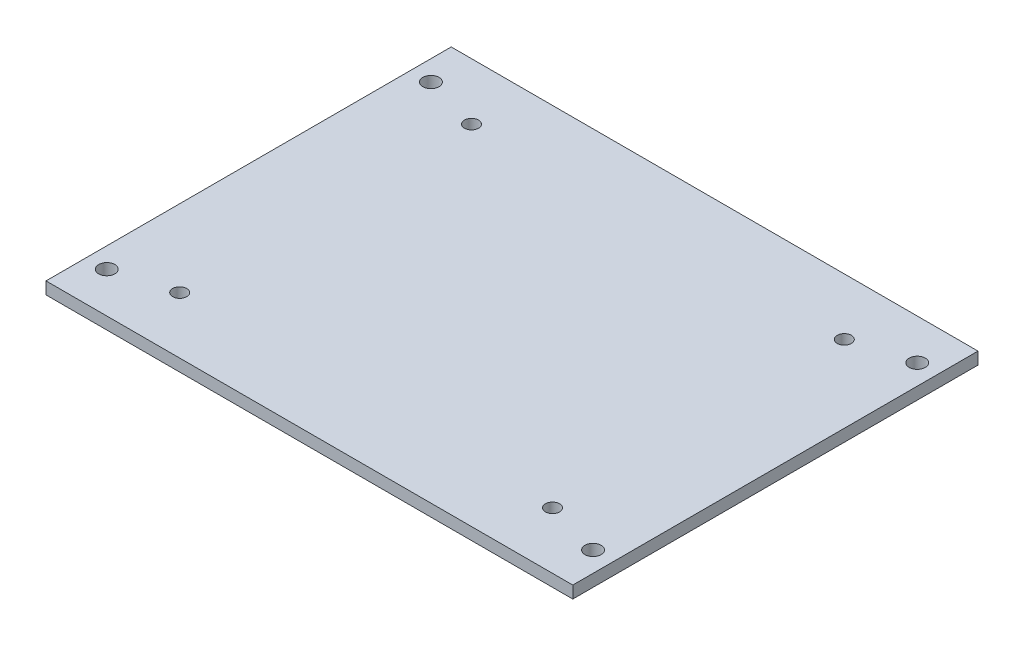
ISO-10303-21;
HEADER;
FILE_DESCRIPTION(('STEP AP214'),'2;1');
FILE_NAME('part.step','',(''),(''),'','','');
FILE_SCHEMA(('AUTOMOTIVE_DESIGN { 1 0 10303 214 1 1 1 1 }'));
ENDSEC;
DATA;
#1=APPLICATION_CONTEXT('core data for automotive mechanical design processes');
#2=APPLICATION_PROTOCOL_DEFINITION('international standard','automotive_design',2000,#1);
#3=PRODUCT_CONTEXT('',#1,'mechanical');
#4=PRODUCT('Part','Part','',(#3));
#5=PRODUCT_RELATED_PRODUCT_CATEGORY('part','',(#4));
#6=PRODUCT_DEFINITION_FORMATION('','',#4);
#7=PRODUCT_DEFINITION_CONTEXT('part definition',#1,'design');
#8=PRODUCT_DEFINITION('design','',#6,#7);
#9=PRODUCT_DEFINITION_SHAPE('','',#8);
#10=(LENGTH_UNIT() NAMED_UNIT(*) SI_UNIT(.MILLI.,.METRE.));
#11=(NAMED_UNIT(*) PLANE_ANGLE_UNIT() SI_UNIT($,.RADIAN.));
#12=(NAMED_UNIT(*) SI_UNIT($,.STERADIAN.) SOLID_ANGLE_UNIT());
#13=UNCERTAINTY_MEASURE_WITH_UNIT(LENGTH_MEASURE(1.E-05),#10,'distance_accuracy_value','');
#14=(GEOMETRIC_REPRESENTATION_CONTEXT(3) GLOBAL_UNCERTAINTY_ASSIGNED_CONTEXT((#13)) GLOBAL_UNIT_ASSIGNED_CONTEXT((#10,
#11,#12)) REPRESENTATION_CONTEXT('',''));
#15=CARTESIAN_POINT('',(0.,0.,0.));
#16=DIRECTION('',(0.,0.,1.));
#17=DIRECTION('',(1.,0.,0.));
#18=AXIS2_PLACEMENT_3D('',#15,#16,#17);
#19=CARTESIAN_POINT('',(-130.,3.,-100.));
#20=DIRECTION('',(1.,0.,0.));
#21=DIRECTION('',(0.,0.,-1.));
#22=AXIS2_PLACEMENT_3D('',#19,#20,#21);
#23=PLANE('',#22);
#24=DIRECTION('',(0.,0.,1.));
#25=VECTOR('',#24,1.);
#26=CARTESIAN_POINT('',(-130.,0.,-100.));
#27=LINE('',#26,#25);
#28=CARTESIAN_POINT('',(-130.,0.,-100.));
#29=VERTEX_POINT('',#28);
#30=CARTESIAN_POINT('',(-130.,0.,0.));
#31=VERTEX_POINT('',#30);
#32=EDGE_CURVE('E109',#29,#31,#27,.T.);
#33=ORIENTED_EDGE('',*,*,#32,.T.);
#34=DIRECTION('',(0.,-1.,0.));
#35=VECTOR('',#34,1.);
#36=CARTESIAN_POINT('',(-130.,3.,0.));
#37=LINE('',#36,#35);
#38=CARTESIAN_POINT('',(-130.,3.,0.));
#39=VERTEX_POINT('',#38);
#40=EDGE_CURVE('E11',#39,#31,#37,.T.);
#41=ORIENTED_EDGE('',*,*,#40,.F.);
#42=DIRECTION('',(0.,0.,1.));
#43=VECTOR('',#42,1.);
#44=CARTESIAN_POINT('',(-130.,3.,-100.));
#45=LINE('',#44,#43);
#46=CARTESIAN_POINT('',(-130.,3.,-100.));
#47=VERTEX_POINT('',#46);
#48=EDGE_CURVE('E92',#47,#39,#45,.T.);
#49=ORIENTED_EDGE('',*,*,#48,.F.);
#50=DIRECTION('',(0.,-1.,0.));
#51=VECTOR('',#50,1.);
#52=CARTESIAN_POINT('',(-130.,3.,-100.));
#53=LINE('',#52,#51);
#54=EDGE_CURVE('E105',#47,#29,#53,.T.);
#55=ORIENTED_EDGE('',*,*,#54,.T.);
#56=EDGE_LOOP('',(#33,#41,#49,#55));
#57=FACE_BOUND('',#56,.T.);
#58=ADVANCED_FACE('F38',(#57),#23,.F.);
#59=CARTESIAN_POINT('',(-130.,3.,0.));
#60=DIRECTION('',(0.,0.,-1.));
#61=DIRECTION('',(-1.,0.,0.));
#62=AXIS2_PLACEMENT_3D('',#59,#60,#61);
#63=PLANE('',#62);
#64=DIRECTION('',(1.,0.,0.));
#65=VECTOR('',#64,1.);
#66=CARTESIAN_POINT('',(-130.,0.,0.));
#67=LINE('',#66,#65);
#68=CARTESIAN_POINT('',(0.,0.,0.));
#69=VERTEX_POINT('',#68);
#70=EDGE_CURVE('E97',#31,#69,#67,.T.);
#71=ORIENTED_EDGE('',*,*,#70,.T.);
#72=DIRECTION('',(0.,-1.,0.));
#73=VECTOR('',#72,1.);
#74=CARTESIAN_POINT('',(0.,3.,0.));
#75=LINE('',#74,#73);
#76=CARTESIAN_POINT('',(0.,3.,0.));
#77=VERTEX_POINT('',#76);
#78=EDGE_CURVE('E48',#77,#69,#75,.T.);
#79=ORIENTED_EDGE('',*,*,#78,.F.);
#80=DIRECTION('',(1.,0.,0.));
#81=VECTOR('',#80,1.);
#82=CARTESIAN_POINT('',(-130.,3.,0.));
#83=LINE('',#82,#81);
#84=EDGE_CURVE('E87',#39,#77,#83,.T.);
#85=ORIENTED_EDGE('',*,*,#84,.F.);
#86=ORIENTED_EDGE('',*,*,#40,.T.);
#87=EDGE_LOOP('',(#71,#79,#85,#86));
#88=FACE_BOUND('',#87,.T.);
#89=ADVANCED_FACE('F96',(#88),#63,.F.);
#90=CARTESIAN_POINT('',(0.,3.,-100.));
#91=DIRECTION('',(-1.,0.,0.));
#92=DIRECTION('',(0.,0.,1.));
#93=AXIS2_PLACEMENT_3D('',#90,#91,#92);
#94=PLANE('',#93);
#95=DIRECTION('',(0.,0.,-1.));
#96=VECTOR('',#95,1.);
#97=CARTESIAN_POINT('',(0.,0.,-100.));
#98=LINE('',#97,#96);
#99=CARTESIAN_POINT('',(0.,0.,-100.));
#100=VERTEX_POINT('',#99);
#101=EDGE_CURVE('E74',#69,#100,#98,.T.);
#102=ORIENTED_EDGE('',*,*,#101,.T.);
#103=DIRECTION('',(0.,-1.,0.));
#104=VECTOR('',#103,1.);
#105=CARTESIAN_POINT('',(0.,3.,-100.));
#106=LINE('',#105,#104);
#107=CARTESIAN_POINT('',(0.,3.,-100.));
#108=VERTEX_POINT('',#107);
#109=EDGE_CURVE('E99',#108,#100,#106,.T.);
#110=ORIENTED_EDGE('',*,*,#109,.F.);
#111=DIRECTION('',(0.,0.,-1.));
#112=VECTOR('',#111,1.);
#113=CARTESIAN_POINT('',(0.,3.,-100.));
#114=LINE('',#113,#112);
#115=EDGE_CURVE('E90',#77,#108,#114,.T.);
#116=ORIENTED_EDGE('',*,*,#115,.F.);
#117=ORIENTED_EDGE('',*,*,#78,.T.);
#118=EDGE_LOOP('',(#102,#110,#116,#117));
#119=FACE_BOUND('',#118,.T.);
#120=ADVANCED_FACE('F101',(#119),#94,.F.);
#121=CARTESIAN_POINT('',(-130.,3.,-100.));
#122=DIRECTION('',(0.,0.,1.));
#123=DIRECTION('',(1.,0.,0.));
#124=AXIS2_PLACEMENT_3D('',#121,#122,#123);
#125=PLANE('',#124);
#126=DIRECTION('',(-1.,0.,0.));
#127=VECTOR('',#126,1.);
#128=CARTESIAN_POINT('',(-130.,0.,-100.));
#129=LINE('',#128,#127);
#130=EDGE_CURVE('E80',#100,#29,#129,.T.);
#131=ORIENTED_EDGE('',*,*,#130,.T.);
#132=ORIENTED_EDGE('',*,*,#54,.F.);
#133=DIRECTION('',(-1.,0.,0.));
#134=VECTOR('',#133,1.);
#135=CARTESIAN_POINT('',(-130.,3.,-100.));
#136=LINE('',#135,#134);
#137=EDGE_CURVE('E57',#108,#47,#136,.T.);
#138=ORIENTED_EDGE('',*,*,#137,.F.);
#139=ORIENTED_EDGE('',*,*,#109,.T.);
#140=EDGE_LOOP('',(#131,#132,#138,#139));
#141=FACE_BOUND('',#140,.T.);
#142=ADVANCED_FACE('F192',(#141),#125,.F.);
#143=CARTESIAN_POINT('',(0.,3.,0.));
#144=DIRECTION('',(0.,1.,0.));
#145=DIRECTION('',(0.,0.,1.));
#146=AXIS2_PLACEMENT_3D('',#143,#144,#145);
#147=PLANE('',#146);
#148=CARTESIAN_POINT('',(-5.,3.,-10.));
#149=DIRECTION('',(0.,1.,0.));
#150=DIRECTION('',(0.,0.,1.));
#151=AXIS2_PLACEMENT_3D('',#148,#149,#150);
#152=CIRCLE('',#151,2.);
#153=CARTESIAN_POINT('',(-5.,3.,-8.));
#154=VERTEX_POINT('',#153);
#155=EDGE_CURVE('E150',#154,#154,#152,.T.);
#156=ORIENTED_EDGE('',*,*,#155,.F.);
#157=EDGE_LOOP('',(#156));
#158=FACE_BOUND('',#157,.T.);
#159=CARTESIAN_POINT('',(-125.,3.,-10.));
#160=DIRECTION('',(0.,1.,0.));
#161=DIRECTION('',(0.,0.,1.));
#162=AXIS2_PLACEMENT_3D('',#159,#160,#161);
#163=CIRCLE('',#162,2.);
#164=CARTESIAN_POINT('',(-125.,3.,-8.));
#165=VERTEX_POINT('',#164);
#166=EDGE_CURVE('E137',#165,#165,#163,.T.);
#167=ORIENTED_EDGE('',*,*,#166,.F.);
#168=EDGE_LOOP('',(#167));
#169=FACE_BOUND('',#168,.T.);
#170=CARTESIAN_POINT('',(-5.,3.,-90.));
#171=DIRECTION('',(0.,1.,0.));
#172=DIRECTION('',(0.,0.,1.));
#173=AXIS2_PLACEMENT_3D('',#170,#171,#172);
#174=CIRCLE('',#173,2.);
#175=CARTESIAN_POINT('',(-5.,3.,-88.));
#176=VERTEX_POINT('',#175);
#177=EDGE_CURVE('E129',#176,#176,#174,.T.);
#178=ORIENTED_EDGE('',*,*,#177,.F.);
#179=EDGE_LOOP('',(#178));
#180=FACE_BOUND('',#179,.T.);
#181=CARTESIAN_POINT('',(-125.,3.,-90.));
#182=DIRECTION('',(0.,1.,0.));
#183=DIRECTION('',(0.,0.,1.));
#184=AXIS2_PLACEMENT_3D('',#181,#182,#183);
#185=CIRCLE('',#184,2.);
#186=CARTESIAN_POINT('',(-125.,3.,-88.));
#187=VERTEX_POINT('',#186);
#188=EDGE_CURVE('E136',#187,#187,#185,.T.);
#189=ORIENTED_EDGE('',*,*,#188,.F.);
#190=EDGE_LOOP('',(#189));
#191=FACE_BOUND('',#190,.T.);
#192=CARTESIAN_POINT('',(-111.,3.,-14.));
#193=DIRECTION('',(0.,1.,0.));
#194=DIRECTION('',(0.,0.,1.));
#195=AXIS2_PLACEMENT_3D('',#192,#193,#194);
#196=CIRCLE('',#195,1.75);
#197=CARTESIAN_POINT('',(-111.,3.,-12.25));
#198=VERTEX_POINT('',#197);
#199=EDGE_CURVE('E132',#198,#198,#196,.T.);
#200=ORIENTED_EDGE('',*,*,#199,.F.);
#201=EDGE_LOOP('',(#200));
#202=FACE_BOUND('',#201,.T.);
#203=CARTESIAN_POINT('',(-19.,3.,-14.));
#204=DIRECTION('',(0.,1.,0.));
#205=DIRECTION('',(0.,0.,1.));
#206=AXIS2_PLACEMENT_3D('',#203,#204,#205);
#207=CIRCLE('',#206,1.75);
#208=CARTESIAN_POINT('',(-19.,3.,-12.25));
#209=VERTEX_POINT('',#208);
#210=EDGE_CURVE('E169',#209,#209,#207,.T.);
#211=ORIENTED_EDGE('',*,*,#210,.F.);
#212=EDGE_LOOP('',(#211));
#213=FACE_BOUND('',#212,.T.);
#214=CARTESIAN_POINT('',(-19.,3.,-86.));
#215=DIRECTION('',(0.,1.,0.));
#216=DIRECTION('',(0.,0.,1.));
#217=AXIS2_PLACEMENT_3D('',#214,#215,#216);
#218=CIRCLE('',#217,1.75);
#219=CARTESIAN_POINT('',(-19.,3.,-84.25));
#220=VERTEX_POINT('',#219);
#221=EDGE_CURVE('E161',#220,#220,#218,.T.);
#222=ORIENTED_EDGE('',*,*,#221,.F.);
#223=EDGE_LOOP('',(#222));
#224=FACE_BOUND('',#223,.T.);
#225=CARTESIAN_POINT('',(-111.,3.,-86.));
#226=DIRECTION('',(0.,1.,0.));
#227=DIRECTION('',(0.,0.,1.));
#228=AXIS2_PLACEMENT_3D('',#225,#226,#227);
#229=CIRCLE('',#228,1.75);
#230=CARTESIAN_POINT('',(-111.,3.,-84.25));
#231=VERTEX_POINT('',#230);
#232=EDGE_CURVE('E160',#231,#231,#229,.T.);
#233=ORIENTED_EDGE('',*,*,#232,.F.);
#234=EDGE_LOOP('',(#233));
#235=FACE_BOUND('',#234,.T.);
#236=ORIENTED_EDGE('',*,*,#48,.T.);
#237=ORIENTED_EDGE('',*,*,#84,.T.);
#238=ORIENTED_EDGE('',*,*,#115,.T.);
#239=ORIENTED_EDGE('',*,*,#137,.T.);
#240=EDGE_LOOP('',(#236,#237,#238,#239));
#241=FACE_BOUND('',#240,.T.);
#242=ADVANCED_FACE('F88',(#158,#169,#180,#191,#202,#213,#224,#235,#241),#147,.T.);
#243=CARTESIAN_POINT('',(0.,0.,0.));
#244=DIRECTION('',(0.,1.,0.));
#245=DIRECTION('',(0.,0.,1.));
#246=AXIS2_PLACEMENT_3D('',#243,#244,#245);
#247=PLANE('',#246);
#248=CARTESIAN_POINT('',(-5.,0.,-10.));
#249=DIRECTION('',(0.,1.,0.));
#250=DIRECTION('',(0.,0.,1.));
#251=AXIS2_PLACEMENT_3D('',#248,#249,#250);
#252=CIRCLE('',#251,2.);
#253=CARTESIAN_POINT('',(-5.,0.,-8.));
#254=VERTEX_POINT('',#253);
#255=EDGE_CURVE('E41',#254,#254,#252,.T.);
#256=ORIENTED_EDGE('',*,*,#255,.T.);
#257=EDGE_LOOP('',(#256));
#258=FACE_BOUND('',#257,.T.);
#259=CARTESIAN_POINT('',(-125.,0.,-10.));
#260=DIRECTION('',(0.,1.,0.));
#261=DIRECTION('',(0.,0.,1.));
#262=AXIS2_PLACEMENT_3D('',#259,#260,#261);
#263=CIRCLE('',#262,2.);
#264=CARTESIAN_POINT('',(-125.,0.,-8.));
#265=VERTEX_POINT('',#264);
#266=EDGE_CURVE('E133',#265,#265,#263,.T.);
#267=ORIENTED_EDGE('',*,*,#266,.T.);
#268=EDGE_LOOP('',(#267));
#269=FACE_BOUND('',#268,.T.);
#270=CARTESIAN_POINT('',(-5.,0.,-90.));
#271=DIRECTION('',(0.,1.,0.));
#272=DIRECTION('',(0.,0.,1.));
#273=AXIS2_PLACEMENT_3D('',#270,#271,#272);
#274=CIRCLE('',#273,2.);
#275=CARTESIAN_POINT('',(-5.,0.,-88.));
#276=VERTEX_POINT('',#275);
#277=EDGE_CURVE('E128',#276,#276,#274,.T.);
#278=ORIENTED_EDGE('',*,*,#277,.T.);
#279=EDGE_LOOP('',(#278));
#280=FACE_BOUND('',#279,.T.);
#281=CARTESIAN_POINT('',(-125.,0.,-90.));
#282=DIRECTION('',(0.,1.,0.));
#283=DIRECTION('',(0.,0.,1.));
#284=AXIS2_PLACEMENT_3D('',#281,#282,#283);
#285=CIRCLE('',#284,2.);
#286=CARTESIAN_POINT('',(-125.,0.,-88.));
#287=VERTEX_POINT('',#286);
#288=EDGE_CURVE('E124',#287,#287,#285,.T.);
#289=ORIENTED_EDGE('',*,*,#288,.T.);
#290=EDGE_LOOP('',(#289));
#291=FACE_BOUND('',#290,.T.);
#292=CARTESIAN_POINT('',(-111.,0.,-14.));
#293=DIRECTION('',(0.,1.,0.));
#294=DIRECTION('',(0.,0.,1.));
#295=AXIS2_PLACEMENT_3D('',#292,#293,#294);
#296=CIRCLE('',#295,1.75);
#297=CARTESIAN_POINT('',(-111.,0.,-12.25));
#298=VERTEX_POINT('',#297);
#299=EDGE_CURVE('E173',#298,#298,#296,.T.);
#300=ORIENTED_EDGE('',*,*,#299,.T.);
#301=EDGE_LOOP('',(#300));
#302=FACE_BOUND('',#301,.T.);
#303=CARTESIAN_POINT('',(-19.,0.,-14.));
#304=DIRECTION('',(0.,1.,0.));
#305=DIRECTION('',(0.,0.,1.));
#306=AXIS2_PLACEMENT_3D('',#303,#304,#305);
#307=CIRCLE('',#306,1.75);
#308=CARTESIAN_POINT('',(-19.,0.,-12.25));
#309=VERTEX_POINT('',#308);
#310=EDGE_CURVE('E165',#309,#309,#307,.T.);
#311=ORIENTED_EDGE('',*,*,#310,.T.);
#312=EDGE_LOOP('',(#311));
#313=FACE_BOUND('',#312,.T.);
#314=CARTESIAN_POINT('',(-19.,0.,-86.));
#315=DIRECTION('',(0.,1.,0.));
#316=DIRECTION('',(0.,0.,1.));
#317=AXIS2_PLACEMENT_3D('',#314,#315,#316);
#318=CIRCLE('',#317,1.75);
#319=CARTESIAN_POINT('',(-19.,0.,-84.25));
#320=VERTEX_POINT('',#319);
#321=EDGE_CURVE('E156',#320,#320,#318,.T.);
#322=ORIENTED_EDGE('',*,*,#321,.T.);
#323=EDGE_LOOP('',(#322));
#324=FACE_BOUND('',#323,.T.);
#325=CARTESIAN_POINT('',(-111.,0.,-86.));
#326=DIRECTION('',(0.,1.,0.));
#327=DIRECTION('',(0.,0.,1.));
#328=AXIS2_PLACEMENT_3D('',#325,#326,#327);
#329=CIRCLE('',#328,1.75);
#330=CARTESIAN_POINT('',(-111.,0.,-84.25));
#331=VERTEX_POINT('',#330);
#332=EDGE_CURVE('E113',#331,#331,#329,.T.);
#333=ORIENTED_EDGE('',*,*,#332,.T.);
#334=EDGE_LOOP('',(#333));
#335=FACE_BOUND('',#334,.T.);
#336=ORIENTED_EDGE('',*,*,#32,.F.);
#337=ORIENTED_EDGE('',*,*,#130,.F.);
#338=ORIENTED_EDGE('',*,*,#101,.F.);
#339=ORIENTED_EDGE('',*,*,#70,.F.);
#340=EDGE_LOOP('',(#336,#337,#338,#339));
#341=FACE_BOUND('',#340,.T.);
#342=ADVANCED_FACE('F191',(#258,#269,#280,#291,#302,#313,#324,#335,#341),#247,.F.);
#343=CARTESIAN_POINT('',(-111.,0.,-86.));
#344=DIRECTION('',(0.,1.,0.));
#345=DIRECTION('',(0.,0.,1.));
#346=AXIS2_PLACEMENT_3D('',#343,#344,#345);
#347=CYLINDRICAL_SURFACE('',#346,1.75);
#348=ORIENTED_EDGE('',*,*,#332,.F.);
#349=EDGE_LOOP('',(#348));
#350=FACE_BOUND('',#349,.T.);
#351=ORIENTED_EDGE('',*,*,#232,.T.);
#352=EDGE_LOOP('',(#351));
#353=FACE_BOUND('',#352,.T.);
#354=ADVANCED_FACE('F188',(#350,#353),#347,.F.);
#355=CARTESIAN_POINT('',(-19.,0.,-86.));
#356=DIRECTION('',(0.,1.,0.));
#357=DIRECTION('',(0.,0.,1.));
#358=AXIS2_PLACEMENT_3D('',#355,#356,#357);
#359=CYLINDRICAL_SURFACE('',#358,1.75);
#360=ORIENTED_EDGE('',*,*,#321,.F.);
#361=EDGE_LOOP('',(#360));
#362=FACE_BOUND('',#361,.T.);
#363=ORIENTED_EDGE('',*,*,#221,.T.);
#364=EDGE_LOOP('',(#363));
#365=FACE_BOUND('',#364,.T.);
#366=ADVANCED_FACE('F241',(#362,#365),#359,.F.);
#367=CARTESIAN_POINT('',(-19.,0.,-14.));
#368=DIRECTION('',(0.,1.,0.));
#369=DIRECTION('',(0.,0.,1.));
#370=AXIS2_PLACEMENT_3D('',#367,#368,#369);
#371=CYLINDRICAL_SURFACE('',#370,1.75);
#372=ORIENTED_EDGE('',*,*,#310,.F.);
#373=EDGE_LOOP('',(#372));
#374=FACE_BOUND('',#373,.T.);
#375=ORIENTED_EDGE('',*,*,#210,.T.);
#376=EDGE_LOOP('',(#375));
#377=FACE_BOUND('',#376,.T.);
#378=ADVANCED_FACE('F247',(#374,#377),#371,.F.);
#379=CARTESIAN_POINT('',(-111.,0.,-14.));
#380=DIRECTION('',(0.,1.,0.));
#381=DIRECTION('',(0.,0.,1.));
#382=AXIS2_PLACEMENT_3D('',#379,#380,#381);
#383=CYLINDRICAL_SURFACE('',#382,1.75);
#384=ORIENTED_EDGE('',*,*,#299,.F.);
#385=EDGE_LOOP('',(#384));
#386=FACE_BOUND('',#385,.T.);
#387=ORIENTED_EDGE('',*,*,#199,.T.);
#388=EDGE_LOOP('',(#387));
#389=FACE_BOUND('',#388,.T.);
#390=ADVANCED_FACE('F255',(#386,#389),#383,.F.);
#391=CARTESIAN_POINT('',(-125.,-7.,-90.));
#392=DIRECTION('',(0.,1.,0.));
#393=DIRECTION('',(0.,0.,1.));
#394=AXIS2_PLACEMENT_3D('',#391,#392,#393);
#395=CYLINDRICAL_SURFACE('',#394,2.);
#396=ORIENTED_EDGE('',*,*,#188,.T.);
#397=EDGE_LOOP('',(#396));
#398=FACE_BOUND('',#397,.T.);
#399=ORIENTED_EDGE('',*,*,#288,.F.);
#400=EDGE_LOOP('',(#399));
#401=FACE_BOUND('',#400,.T.);
#402=ADVANCED_FACE('F263',(#398,#401),#395,.F.);
#403=CARTESIAN_POINT('',(-5.,-7.,-90.));
#404=DIRECTION('',(0.,1.,0.));
#405=DIRECTION('',(0.,0.,1.));
#406=AXIS2_PLACEMENT_3D('',#403,#404,#405);
#407=CYLINDRICAL_SURFACE('',#406,2.);
#408=ORIENTED_EDGE('',*,*,#177,.T.);
#409=EDGE_LOOP('',(#408));
#410=FACE_BOUND('',#409,.T.);
#411=ORIENTED_EDGE('',*,*,#277,.F.);
#412=EDGE_LOOP('',(#411));
#413=FACE_BOUND('',#412,.T.);
#414=ADVANCED_FACE('F271',(#410,#413),#407,.F.);
#415=CARTESIAN_POINT('',(-125.,-7.,-10.));
#416=DIRECTION('',(0.,1.,0.));
#417=DIRECTION('',(0.,0.,1.));
#418=AXIS2_PLACEMENT_3D('',#415,#416,#417);
#419=CYLINDRICAL_SURFACE('',#418,2.);
#420=ORIENTED_EDGE('',*,*,#166,.T.);
#421=EDGE_LOOP('',(#420));
#422=FACE_BOUND('',#421,.T.);
#423=ORIENTED_EDGE('',*,*,#266,.F.);
#424=EDGE_LOOP('',(#423));
#425=FACE_BOUND('',#424,.T.);
#426=ADVANCED_FACE('F279',(#422,#425),#419,.F.);
#427=CARTESIAN_POINT('',(-5.,-7.,-10.));
#428=DIRECTION('',(0.,1.,0.));
#429=DIRECTION('',(0.,0.,1.));
#430=AXIS2_PLACEMENT_3D('',#427,#428,#429);
#431=CYLINDRICAL_SURFACE('',#430,2.);
#432=ORIENTED_EDGE('',*,*,#155,.T.);
#433=EDGE_LOOP('',(#432));
#434=FACE_BOUND('',#433,.T.);
#435=ORIENTED_EDGE('',*,*,#255,.F.);
#436=EDGE_LOOP('',(#435));
#437=FACE_BOUND('',#436,.T.);
#438=ADVANCED_FACE('F286',(#434,#437),#431,.F.);
#439=CLOSED_SHELL('',(#58,#89,#120,#142,#242,#342,#354,#366,#378,#390,#402,#414,#426,#438));
#440=MANIFOLD_SOLID_BREP('B2',#439);
#441=ADVANCED_BREP_SHAPE_REPRESENTATION('',(#18,#440),#14);
#442=SHAPE_DEFINITION_REPRESENTATION(#9,#441);
ENDSEC;
END-ISO-10303-21;
